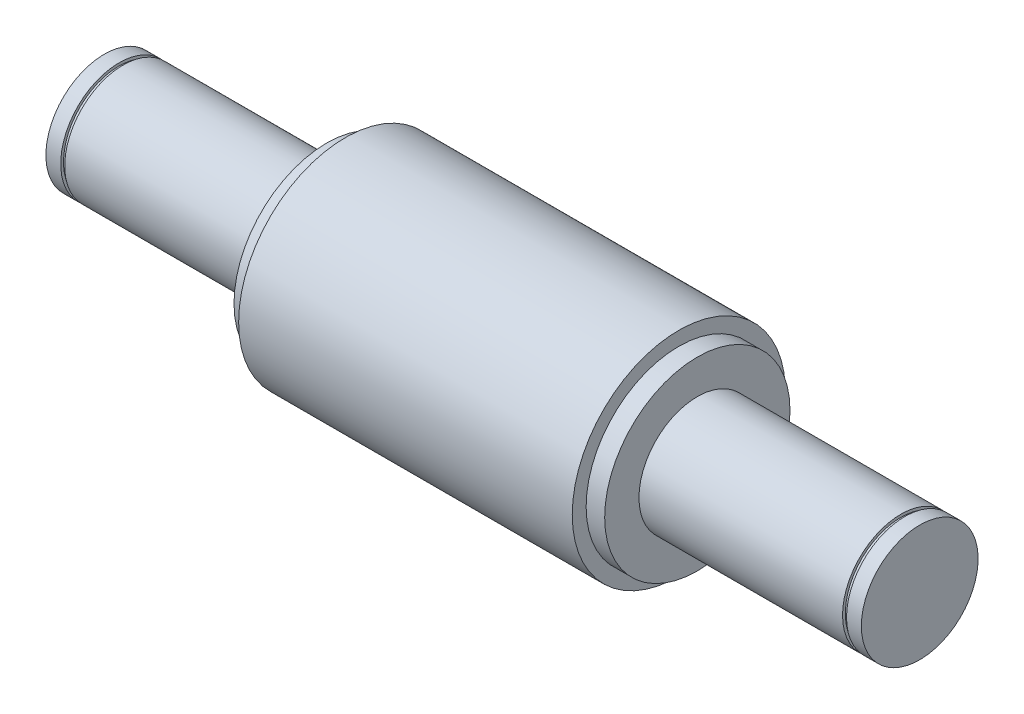
ISO-10303-21;
HEADER;
FILE_DESCRIPTION(('STEP AP214'),'2;1');
FILE_NAME('part.step','',(''),(''),'','','');
FILE_SCHEMA(('AUTOMOTIVE_DESIGN { 1 0 10303 214 1 1 1 1 }'));
ENDSEC;
DATA;
#1=APPLICATION_CONTEXT('core data for automotive mechanical design processes');
#2=APPLICATION_PROTOCOL_DEFINITION('international standard','automotive_design',2000,#1);
#3=PRODUCT_CONTEXT('',#1,'mechanical');
#4=PRODUCT('Part','Part','',(#3));
#5=PRODUCT_RELATED_PRODUCT_CATEGORY('part','',(#4));
#6=PRODUCT_DEFINITION_FORMATION('','',#4);
#7=PRODUCT_DEFINITION_CONTEXT('part definition',#1,'design');
#8=PRODUCT_DEFINITION('design','',#6,#7);
#9=PRODUCT_DEFINITION_SHAPE('','',#8);
#10=(LENGTH_UNIT() NAMED_UNIT(*) SI_UNIT(.MILLI.,.METRE.));
#11=(NAMED_UNIT(*) PLANE_ANGLE_UNIT() SI_UNIT($,.RADIAN.));
#12=(NAMED_UNIT(*) SI_UNIT($,.STERADIAN.) SOLID_ANGLE_UNIT());
#13=UNCERTAINTY_MEASURE_WITH_UNIT(LENGTH_MEASURE(1.E-05),#10,'distance_accuracy_value','');
#14=(GEOMETRIC_REPRESENTATION_CONTEXT(3) GLOBAL_UNCERTAINTY_ASSIGNED_CONTEXT((#13)) GLOBAL_UNIT_ASSIGNED_CONTEXT((#10,
#11,#12)) REPRESENTATION_CONTEXT('',''));
#15=CARTESIAN_POINT('',(0.,0.,0.));
#16=DIRECTION('',(0.,0.,1.));
#17=DIRECTION('',(1.,0.,0.));
#18=AXIS2_PLACEMENT_3D('',#15,#16,#17);
#19=CARTESIAN_POINT('',(100.,0.,0.));
#20=DIRECTION('',(1.,0.,0.));
#21=DIRECTION('',(0.,0.,-1.));
#22=AXIS2_PLACEMENT_3D('',#19,#20,#21);
#23=PLANE('',#22);
#24=CARTESIAN_POINT('',(100.,0.,0.));
#25=DIRECTION('',(1.,0.,0.));
#26=DIRECTION('',(0.,0.,-1.));
#27=AXIS2_PLACEMENT_3D('',#24,#25,#26);
#28=CIRCLE('',#27,50.);
#29=CARTESIAN_POINT('',(100.,0.,-50.));
#30=VERTEX_POINT('',#29);
#31=EDGE_CURVE('E43',#30,#30,#28,.T.);
#32=ORIENTED_EDGE('',*,*,#31,.T.);
#33=EDGE_LOOP('',(#32));
#34=FACE_BOUND('',#33,.T.);
#35=CARTESIAN_POINT('',(100.,0.,0.));
#36=DIRECTION('',(1.,0.,0.));
#37=DIRECTION('',(0.,0.,-1.));
#38=AXIS2_PLACEMENT_3D('',#35,#36,#37);
#39=CIRCLE('',#38,31.5);
#40=CARTESIAN_POINT('',(100.,0.,31.5));
#41=VERTEX_POINT('',#40);
#42=EDGE_CURVE('E58',#41,#41,#39,.T.);
#43=ORIENTED_EDGE('',*,*,#42,.F.);
#44=EDGE_LOOP('',(#43));
#45=FACE_BOUND('',#44,.T.);
#46=ADVANCED_FACE('F35',(#34,#45),#23,.T.);
#47=CARTESIAN_POINT('',(100.,0.,0.));
#48=DIRECTION('',(-1.,0.,0.));
#49=DIRECTION('',(0.,0.,1.));
#50=AXIS2_PLACEMENT_3D('',#47,#48,#49);
#51=CYLINDRICAL_SURFACE('',#50,50.);
#52=CARTESIAN_POINT('',(90.,0.,0.));
#53=DIRECTION('',(1.,0.,0.));
#54=DIRECTION('',(0.,0.,-1.));
#55=AXIS2_PLACEMENT_3D('',#52,#53,#54);
#56=CIRCLE('',#55,50.);
#57=CARTESIAN_POINT('',(90.,0.,-50.));
#58=VERTEX_POINT('',#57);
#59=EDGE_CURVE('E87',#58,#58,#56,.T.);
#60=ORIENTED_EDGE('',*,*,#59,.T.);
#61=EDGE_LOOP('',(#60));
#62=FACE_BOUND('',#61,.T.);
#63=ORIENTED_EDGE('',*,*,#31,.F.);
#64=EDGE_LOOP('',(#63));
#65=FACE_BOUND('',#64,.T.);
#66=ADVANCED_FACE('F37',(#62,#65),#51,.T.);
#67=CARTESIAN_POINT('',(90.,0.,0.));
#68=DIRECTION('',(1.,0.,0.));
#69=DIRECTION('',(0.,0.,-1.));
#70=AXIS2_PLACEMENT_3D('',#67,#68,#69);
#71=PLANE('',#70);
#72=CARTESIAN_POINT('',(90.,0.,0.));
#73=DIRECTION('',(1.,0.,0.));
#74=DIRECTION('',(0.,0.,-1.));
#75=AXIS2_PLACEMENT_3D('',#72,#73,#74);
#76=CIRCLE('',#75,57.5);
#77=CARTESIAN_POINT('',(90.,0.,57.5));
#78=VERTEX_POINT('',#77);
#79=EDGE_CURVE('E93',#78,#78,#76,.T.);
#80=ORIENTED_EDGE('',*,*,#79,.T.);
#81=EDGE_LOOP('',(#80));
#82=FACE_BOUND('',#81,.T.);
#83=ORIENTED_EDGE('',*,*,#59,.F.);
#84=EDGE_LOOP('',(#83));
#85=FACE_BOUND('',#84,.T.);
#86=ADVANCED_FACE('F103',(#82,#85),#71,.T.);
#87=CARTESIAN_POINT('',(-90.,0.,0.));
#88=DIRECTION('',(1.,0.,0.));
#89=DIRECTION('',(0.,0.,-1.));
#90=AXIS2_PLACEMENT_3D('',#87,#88,#89);
#91=PLANE('',#90);
#92=CARTESIAN_POINT('',(-90.,0.,0.));
#93=DIRECTION('',(1.,0.,0.));
#94=DIRECTION('',(0.,0.,-1.));
#95=AXIS2_PLACEMENT_3D('',#92,#93,#94);
#96=CIRCLE('',#95,57.5);
#97=CARTESIAN_POINT('',(-90.,0.,57.5));
#98=VERTEX_POINT('',#97);
#99=EDGE_CURVE('E92',#98,#98,#96,.T.);
#100=ORIENTED_EDGE('',*,*,#99,.F.);
#101=EDGE_LOOP('',(#100));
#102=FACE_BOUND('',#101,.T.);
#103=CARTESIAN_POINT('',(-90.,0.,0.));
#104=DIRECTION('',(1.,0.,0.));
#105=DIRECTION('',(0.,0.,-1.));
#106=AXIS2_PLACEMENT_3D('',#103,#104,#105);
#107=CIRCLE('',#106,50.);
#108=CARTESIAN_POINT('',(-90.,0.,-50.));
#109=VERTEX_POINT('',#108);
#110=EDGE_CURVE('E10',#109,#109,#107,.T.);
#111=ORIENTED_EDGE('',*,*,#110,.T.);
#112=EDGE_LOOP('',(#111));
#113=FACE_BOUND('',#112,.T.);
#114=ADVANCED_FACE('F101',(#102,#113),#91,.F.);
#115=CARTESIAN_POINT('',(90.,0.,0.));
#116=DIRECTION('',(-1.,0.,0.));
#117=DIRECTION('',(0.,0.,1.));
#118=AXIS2_PLACEMENT_3D('',#115,#116,#117);
#119=CYLINDRICAL_SURFACE('',#118,57.5);
#120=CARTESIAN_POINT('',(90.,0.,57.5));
#121=CARTESIAN_POINT('',(88.125,0.,57.5));
#122=CARTESIAN_POINT('',(86.25,0.,57.5));
#123=CARTESIAN_POINT('',(82.5,0.,57.5));
#124=CARTESIAN_POINT('',(80.625,0.,57.5));
#125=CARTESIAN_POINT('',(76.875,0.,57.5));
#126=CARTESIAN_POINT('',(75.,0.,57.5));
#127=CARTESIAN_POINT('',(71.25,0.,57.5));
#128=CARTESIAN_POINT('',(69.375,0.,57.5));
#129=CARTESIAN_POINT('',(65.625,0.,57.5));
#130=CARTESIAN_POINT('',(63.75,0.,57.5));
#131=CARTESIAN_POINT('',(60.,0.,57.5));
#132=CARTESIAN_POINT('',(58.125,0.,57.5));
#133=CARTESIAN_POINT('',(54.375,0.,57.5));
#134=CARTESIAN_POINT('',(52.5,0.,57.5));
#135=CARTESIAN_POINT('',(48.75,0.,57.5));
#136=CARTESIAN_POINT('',(46.875,0.,57.5));
#137=CARTESIAN_POINT('',(43.125,0.,57.5));
#138=CARTESIAN_POINT('',(41.25,0.,57.5));
#139=CARTESIAN_POINT('',(37.5,0.,57.5));
#140=CARTESIAN_POINT('',(35.625,0.,57.5));
#141=CARTESIAN_POINT('',(31.875,0.,57.5));
#142=CARTESIAN_POINT('',(30.,0.,57.5));
#143=CARTESIAN_POINT('',(26.25,0.,57.5));
#144=CARTESIAN_POINT('',(24.375,0.,57.5));
#145=CARTESIAN_POINT('',(20.625,0.,57.5));
#146=CARTESIAN_POINT('',(18.75,0.,57.5));
#147=CARTESIAN_POINT('',(15.,0.,57.5));
#148=CARTESIAN_POINT('',(13.125,0.,57.5));
#149=CARTESIAN_POINT('',(9.37499999999999,0.,57.5));
#150=CARTESIAN_POINT('',(7.49999999999999,0.,57.5));
#151=CARTESIAN_POINT('',(3.74999999999999,0.,57.5));
#152=CARTESIAN_POINT('',(1.87499999999999,0.,57.5));
#153=CARTESIAN_POINT('',(-1.87500000000002,0.,57.5));
#154=CARTESIAN_POINT('',(-3.75000000000002,0.,57.5));
#155=CARTESIAN_POINT('',(-7.50000000000002,0.,57.5));
#156=CARTESIAN_POINT('',(-9.37500000000002,0.,57.5));
#157=CARTESIAN_POINT('',(-13.125,0.,57.5));
#158=CARTESIAN_POINT('',(-15.,0.,57.5));
#159=CARTESIAN_POINT('',(-18.75,0.,57.5));
#160=CARTESIAN_POINT('',(-20.625,0.,57.5));
#161=CARTESIAN_POINT('',(-24.375,0.,57.5));
#162=CARTESIAN_POINT('',(-26.25,0.,57.5));
#163=CARTESIAN_POINT('',(-30.,0.,57.5));
#164=CARTESIAN_POINT('',(-31.875,0.,57.5));
#165=CARTESIAN_POINT('',(-35.625,0.,57.5));
#166=CARTESIAN_POINT('',(-37.5,0.,57.5));
#167=CARTESIAN_POINT('',(-41.25,0.,57.5));
#168=CARTESIAN_POINT('',(-43.125,0.,57.5));
#169=CARTESIAN_POINT('',(-46.875,0.,57.5));
#170=CARTESIAN_POINT('',(-48.75,0.,57.5));
#171=CARTESIAN_POINT('',(-52.5,0.,57.5));
#172=CARTESIAN_POINT('',(-54.375,0.,57.5));
#173=CARTESIAN_POINT('',(-58.125,0.,57.5));
#174=CARTESIAN_POINT('',(-60.,0.,57.5));
#175=CARTESIAN_POINT('',(-63.75,0.,57.5));
#176=CARTESIAN_POINT('',(-65.625,0.,57.5));
#177=CARTESIAN_POINT('',(-69.375,0.,57.5));
#178=CARTESIAN_POINT('',(-71.25,0.,57.5));
#179=CARTESIAN_POINT('',(-75.,0.,57.5));
#180=CARTESIAN_POINT('',(-76.875,0.,57.5));
#181=CARTESIAN_POINT('',(-80.625,0.,57.5));
#182=CARTESIAN_POINT('',(-82.5,0.,57.5));
#183=CARTESIAN_POINT('',(-86.25,0.,57.5));
#184=CARTESIAN_POINT('',(-88.125,0.,57.5));
#185=CARTESIAN_POINT('',(-90.,0.,57.5));
#186=B_SPLINE_CURVE_WITH_KNOTS('',3,(#120,#121,#122,#123,#124,#125,#126,#127,#128,#129,#130,
#131,#132,#133,#134,#135,#136,#137,#138,#139,#140,#141,#142,#143,#144,#145,#146,#147,#148,#149,
#150,#151,#152,#153,#154,#155,#156,#157,#158,#159,#160,#161,#162,#163,#164,#165,#166,#167,#168,
#169,#170,#171,#172,#173,#174,#175,#176,#177,#178,#179,#180,#181,#182,#183,#184,#185),
.UNSPECIFIED.,.F.,.F.,(4,2,2,2,2,2,2,2,2,2,2,2,2,2,2,2,2,2,2,2,2,2,2,2,2,2,2,2,2,2,2,2,4),(0.,
5.62500000000001,11.25,16.875,22.5,28.125,33.75,39.375,45.,50.625,56.25,61.875,67.5,73.125,
78.75,84.375,90.,95.625,101.25,106.875,112.5,118.125,123.75,129.375,135.,140.625,146.25,151.875,
157.5,163.125,168.75,174.375,180.),.UNSPECIFIED.);
#187=EDGE_CURVE('BSEAM99',#78,#98,#186,.T.);
#188=ORIENTED_EDGE('',*,*,#79,.F.);
#189=ORIENTED_EDGE('',*,*,#99,.T.);
#190=ORIENTED_EDGE('',*,*,#187,.T.);
#191=ORIENTED_EDGE('',*,*,#187,.F.);
#192=EDGE_LOOP('',(#188,#190,#189,#191));
#193=FACE_BOUND('',#192,.T.);
#194=ADVANCED_FACE('F99',(#193),#119,.T.);
#195=CARTESIAN_POINT('',(-100.,0.,0.));
#196=DIRECTION('',(1.,0.,0.));
#197=DIRECTION('',(0.,0.,-1.));
#198=AXIS2_PLACEMENT_3D('',#195,#196,#197);
#199=PLANE('',#198);
#200=CARTESIAN_POINT('',(-100.,0.,0.));
#201=DIRECTION('',(1.,0.,0.));
#202=DIRECTION('',(0.,0.,-1.));
#203=AXIS2_PLACEMENT_3D('',#200,#201,#202);
#204=CIRCLE('',#203,31.5);
#205=CARTESIAN_POINT('',(-100.,0.,-31.5));
#206=VERTEX_POINT('',#205);
#207=EDGE_CURVE('E65',#206,#206,#204,.T.);
#208=ORIENTED_EDGE('',*,*,#207,.T.);
#209=EDGE_LOOP('',(#208));
#210=FACE_BOUND('',#209,.T.);
#211=CARTESIAN_POINT('',(-100.,0.,0.));
#212=DIRECTION('',(1.,0.,0.));
#213=DIRECTION('',(0.,0.,-1.));
#214=AXIS2_PLACEMENT_3D('',#211,#212,#213);
#215=CIRCLE('',#214,50.);
#216=CARTESIAN_POINT('',(-100.,0.,-50.));
#217=VERTEX_POINT('',#216);
#218=EDGE_CURVE('E48',#217,#217,#215,.T.);
#219=ORIENTED_EDGE('',*,*,#218,.F.);
#220=EDGE_LOOP('',(#219));
#221=FACE_BOUND('',#220,.T.);
#222=ADVANCED_FACE('F109',(#210,#221),#199,.F.);
#223=ORIENTED_EDGE('',*,*,#218,.T.);
#224=EDGE_LOOP('',(#223));
#225=FACE_BOUND('',#224,.T.);
#226=ORIENTED_EDGE('',*,*,#110,.F.);
#227=EDGE_LOOP('',(#226));
#228=FACE_BOUND('',#227,.T.);
#229=ADVANCED_FACE('F121',(#225,#228),#51,.T.);
#230=CARTESIAN_POINT('',(220.,0.,0.));
#231=DIRECTION('',(-1.,0.,0.));
#232=DIRECTION('',(0.,0.,1.));
#233=AXIS2_PLACEMENT_3D('',#230,#231,#232);
#234=CYLINDRICAL_SURFACE('',#233,31.5);
#235=CARTESIAN_POINT('',(209.85,0.,0.));
#236=DIRECTION('',(-1.,0.,0.));
#237=DIRECTION('',(0.,0.,1.));
#238=AXIS2_PLACEMENT_3D('',#235,#236,#237);
#239=CIRCLE('',#238,31.5);
#240=CARTESIAN_POINT('',(209.85,0.,31.5));
#241=VERTEX_POINT('',#240);
#242=EDGE_CURVE('E52',#241,#241,#239,.T.);
#243=CARTESIAN_POINT('',(209.85,0.,31.5));
#244=CARTESIAN_POINT('',(208.705729166667,0.,31.5));
#245=CARTESIAN_POINT('',(207.561458333333,0.,31.5));
#246=CARTESIAN_POINT('',(205.272916666667,0.,31.5));
#247=CARTESIAN_POINT('',(204.128645833333,0.,31.5));
#248=CARTESIAN_POINT('',(201.840104166667,0.,31.5));
#249=CARTESIAN_POINT('',(200.695833333333,0.,31.5));
#250=CARTESIAN_POINT('',(198.407291666667,0.,31.5));
#251=CARTESIAN_POINT('',(197.263020833333,0.,31.5));
#252=CARTESIAN_POINT('',(194.974479166667,0.,31.5));
#253=CARTESIAN_POINT('',(193.830208333333,0.,31.5));
#254=CARTESIAN_POINT('',(191.541666666667,0.,31.5));
#255=CARTESIAN_POINT('',(190.397395833333,0.,31.5));
#256=CARTESIAN_POINT('',(188.108854166667,0.,31.5));
#257=CARTESIAN_POINT('',(186.964583333333,0.,31.5));
#258=CARTESIAN_POINT('',(184.676041666667,0.,31.5));
#259=CARTESIAN_POINT('',(183.531770833333,0.,31.5));
#260=CARTESIAN_POINT('',(181.243229166667,0.,31.5));
#261=CARTESIAN_POINT('',(180.098958333333,0.,31.5));
#262=CARTESIAN_POINT('',(177.810416666667,0.,31.5));
#263=CARTESIAN_POINT('',(176.666145833333,0.,31.5));
#264=CARTESIAN_POINT('',(174.377604166667,0.,31.5));
#265=CARTESIAN_POINT('',(173.233333333333,0.,31.5));
#266=CARTESIAN_POINT('',(170.944791666667,0.,31.5));
#267=CARTESIAN_POINT('',(169.800520833333,0.,31.5));
#268=CARTESIAN_POINT('',(167.511979166667,0.,31.5));
#269=CARTESIAN_POINT('',(166.367708333333,0.,31.5));
#270=CARTESIAN_POINT('',(164.079166666667,0.,31.5));
#271=CARTESIAN_POINT('',(162.934895833333,0.,31.5));
#272=CARTESIAN_POINT('',(160.646354166667,0.,31.5));
#273=CARTESIAN_POINT('',(159.502083333333,0.,31.5));
#274=CARTESIAN_POINT('',(157.213541666667,0.,31.5));
#275=CARTESIAN_POINT('',(156.069270833333,0.,31.5));
#276=CARTESIAN_POINT('',(153.780729166667,0.,31.5));
#277=CARTESIAN_POINT('',(152.636458333333,0.,31.5));
#278=CARTESIAN_POINT('',(150.347916666667,0.,31.5));
#279=CARTESIAN_POINT('',(149.203645833333,0.,31.5));
#280=CARTESIAN_POINT('',(146.915104166667,0.,31.5));
#281=CARTESIAN_POINT('',(145.770833333333,0.,31.5));
#282=CARTESIAN_POINT('',(143.482291666667,0.,31.5));
#283=CARTESIAN_POINT('',(142.338020833333,0.,31.5));
#284=CARTESIAN_POINT('',(140.049479166667,0.,31.5));
#285=CARTESIAN_POINT('',(138.905208333333,0.,31.5));
#286=CARTESIAN_POINT('',(136.616666666667,0.,31.5));
#287=CARTESIAN_POINT('',(135.472395833333,0.,31.5));
#288=CARTESIAN_POINT('',(133.183854166667,0.,31.5));
#289=CARTESIAN_POINT('',(132.039583333333,0.,31.5));
#290=CARTESIAN_POINT('',(129.751041666667,0.,31.5));
#291=CARTESIAN_POINT('',(128.606770833333,0.,31.5));
#292=CARTESIAN_POINT('',(126.318229166667,0.,31.5));
#293=CARTESIAN_POINT('',(125.173958333333,0.,31.5));
#294=CARTESIAN_POINT('',(122.885416666667,0.,31.5));
#295=CARTESIAN_POINT('',(121.741145833333,0.,31.5));
#296=CARTESIAN_POINT('',(119.452604166667,0.,31.5));
#297=CARTESIAN_POINT('',(118.308333333333,0.,31.5));
#298=CARTESIAN_POINT('',(116.019791666667,0.,31.5));
#299=CARTESIAN_POINT('',(114.875520833333,0.,31.5));
#300=CARTESIAN_POINT('',(112.586979166667,0.,31.5));
#301=CARTESIAN_POINT('',(111.442708333333,0.,31.5));
#302=CARTESIAN_POINT('',(109.154166666667,0.,31.5));
#303=CARTESIAN_POINT('',(108.009895833333,0.,31.5));
#304=CARTESIAN_POINT('',(105.721354166667,0.,31.5));
#305=CARTESIAN_POINT('',(104.577083333333,0.,31.5));
#306=CARTESIAN_POINT('',(102.288541666667,0.,31.5));
#307=CARTESIAN_POINT('',(101.144270833333,0.,31.5));
#308=CARTESIAN_POINT('',(100.,0.,31.5));
#309=B_SPLINE_CURVE_WITH_KNOTS('',3,(#243,#244,#245,#246,#247,#248,#249,#250,#251,#252,#253,
#254,#255,#256,#257,#258,#259,#260,#261,#262,#263,#264,#265,#266,#267,#268,#269,#270,#271,#272,
#273,#274,#275,#276,#277,#278,#279,#280,#281,#282,#283,#284,#285,#286,#287,#288,#289,#290,#291,
#292,#293,#294,#295,#296,#297,#298,#299,#300,#301,#302,#303,#304,#305,#306,#307,#308),
.UNSPECIFIED.,.F.,.F.,(4,2,2,2,2,2,2,2,2,2,2,2,2,2,2,2,2,2,2,2,2,2,2,2,2,2,2,2,2,2,2,2,4),(0.,
3.43281249999999,6.86562499999999,10.2984375,13.73125,17.1640625,20.596875,24.0296875,27.4625,
30.8953125,34.328125,37.7609375,41.19375,44.6265625,48.059375,51.4921875,54.925,58.3578125,
61.790625,65.2234375,68.6562499999999,72.0890625,75.521875,78.9546875,82.3875,85.8203125,
89.253125,92.6859375,96.11875,99.5515625,102.984375,106.4171875,109.85),.UNSPECIFIED.);
#310=EDGE_CURVE('BSEAM128',#241,#41,#309,.T.);
#311=ORIENTED_EDGE('',*,*,#242,.T.);
#312=ORIENTED_EDGE('',*,*,#42,.T.);
#313=ORIENTED_EDGE('',*,*,#310,.T.);
#314=ORIENTED_EDGE('',*,*,#310,.F.);
#315=EDGE_LOOP('',(#311,#313,#312,#314));
#316=FACE_BOUND('',#315,.T.);
#317=ADVANCED_FACE('F128',(#316),#234,.T.);
#318=CARTESIAN_POINT('',(212.,0.,0.));
#319=DIRECTION('',(1.,0.,0.));
#320=DIRECTION('',(0.,0.,-1.));
#321=AXIS2_PLACEMENT_3D('',#318,#319,#320);
#322=PLANE('',#321);
#323=CARTESIAN_POINT('',(212.,0.,0.));
#324=DIRECTION('',(1.,0.,0.));
#325=DIRECTION('',(0.,0.,-1.));
#326=AXIS2_PLACEMENT_3D('',#323,#324,#325);
#327=CIRCLE('',#326,30.);
#328=CARTESIAN_POINT('',(212.,0.,-30.));
#329=VERTEX_POINT('',#328);
#330=EDGE_CURVE('E77',#329,#329,#327,.T.);
#331=ORIENTED_EDGE('',*,*,#330,.T.);
#332=EDGE_LOOP('',(#331));
#333=FACE_BOUND('',#332,.T.);
#334=CARTESIAN_POINT('',(212.,0.,0.));
#335=DIRECTION('',(1.,0.,0.));
#336=DIRECTION('',(0.,0.,-1.));
#337=AXIS2_PLACEMENT_3D('',#334,#335,#336);
#338=CIRCLE('',#337,31.5);
#339=CARTESIAN_POINT('',(212.,0.,31.5));
#340=VERTEX_POINT('',#339);
#341=EDGE_CURVE('E55',#340,#340,#338,.T.);
#342=ORIENTED_EDGE('',*,*,#341,.F.);
#343=EDGE_LOOP('',(#342));
#344=FACE_BOUND('',#343,.T.);
#345=ADVANCED_FACE('F222',(#333,#344),#322,.F.);
#346=CARTESIAN_POINT('',(209.85,0.,0.));
#347=DIRECTION('',(-1.,0.,0.));
#348=DIRECTION('',(0.,0.,1.));
#349=AXIS2_PLACEMENT_3D('',#346,#347,#348);
#350=PLANE('',#349);
#351=CARTESIAN_POINT('',(209.85,0.,0.));
#352=DIRECTION('',(1.,0.,0.));
#353=DIRECTION('',(0.,0.,-1.));
#354=AXIS2_PLACEMENT_3D('',#351,#352,#353);
#355=CIRCLE('',#354,30.);
#356=CARTESIAN_POINT('',(209.85,0.,-30.));
#357=VERTEX_POINT('',#356);
#358=EDGE_CURVE('E56',#357,#357,#355,.T.);
#359=ORIENTED_EDGE('',*,*,#358,.F.);
#360=EDGE_LOOP('',(#359));
#361=FACE_BOUND('',#360,.T.);
#362=ORIENTED_EDGE('',*,*,#242,.F.);
#363=EDGE_LOOP('',(#362));
#364=FACE_BOUND('',#363,.T.);
#365=ADVANCED_FACE('F213',(#361,#364),#350,.F.);
#366=CARTESIAN_POINT('',(220.,0.,0.));
#367=DIRECTION('',(1.,0.,0.));
#368=DIRECTION('',(0.,0.,-1.));
#369=AXIS2_PLACEMENT_3D('',#366,#367,#368);
#370=CYLINDRICAL_SURFACE('',#369,30.);
#371=ORIENTED_EDGE('',*,*,#358,.T.);
#372=EDGE_LOOP('',(#371));
#373=FACE_BOUND('',#372,.T.);
#374=ORIENTED_EDGE('',*,*,#330,.F.);
#375=EDGE_LOOP('',(#374));
#376=FACE_BOUND('',#375,.T.);
#377=ADVANCED_FACE('F209',(#373,#376),#370,.T.);
#378=CARTESIAN_POINT('',(220.,0.,0.));
#379=DIRECTION('',(1.,0.,0.));
#380=DIRECTION('',(0.,0.,-1.));
#381=AXIS2_PLACEMENT_3D('',#378,#379,#380);
#382=PLANE('',#381);
#383=CARTESIAN_POINT('',(220.,0.,0.));
#384=DIRECTION('',(1.,0.,0.));
#385=DIRECTION('',(0.,0.,-1.));
#386=AXIS2_PLACEMENT_3D('',#383,#384,#385);
#387=CIRCLE('',#386,31.5);
#388=CARTESIAN_POINT('',(220.,0.,31.5));
#389=VERTEX_POINT('',#388);
#390=EDGE_CURVE('E84',#389,#389,#387,.T.);
#391=ORIENTED_EDGE('',*,*,#390,.T.);
#392=EDGE_LOOP('',(#391));
#393=FACE_BOUND('',#392,.T.);
#394=ADVANCED_FACE('F150',(#393),#382,.T.);
#395=CARTESIAN_POINT('',(212.,0.,31.5));
#396=CARTESIAN_POINT('',(212.083333333333,0.,31.5));
#397=CARTESIAN_POINT('',(212.166666666667,0.,31.5));
#398=CARTESIAN_POINT('',(212.333333333333,0.,31.5));
#399=CARTESIAN_POINT('',(212.416666666667,0.,31.5));
#400=CARTESIAN_POINT('',(212.583333333333,0.,31.5));
#401=CARTESIAN_POINT('',(212.666666666667,0.,31.5));
#402=CARTESIAN_POINT('',(212.833333333333,0.,31.5));
#403=CARTESIAN_POINT('',(212.916666666667,0.,31.5));
#404=CARTESIAN_POINT('',(213.083333333333,0.,31.5));
#405=CARTESIAN_POINT('',(213.166666666667,0.,31.5));
#406=CARTESIAN_POINT('',(213.333333333333,0.,31.5));
#407=CARTESIAN_POINT('',(213.416666666667,0.,31.5));
#408=CARTESIAN_POINT('',(213.583333333333,0.,31.5));
#409=CARTESIAN_POINT('',(213.666666666667,0.,31.5));
#410=CARTESIAN_POINT('',(213.833333333333,0.,31.5));
#411=CARTESIAN_POINT('',(213.916666666667,0.,31.5));
#412=CARTESIAN_POINT('',(214.083333333333,0.,31.5));
#413=CARTESIAN_POINT('',(214.166666666667,0.,31.5));
#414=CARTESIAN_POINT('',(214.333333333333,0.,31.5));
#415=CARTESIAN_POINT('',(214.416666666667,0.,31.5));
#416=CARTESIAN_POINT('',(214.583333333333,0.,31.5));
#417=CARTESIAN_POINT('',(214.666666666667,0.,31.5));
#418=CARTESIAN_POINT('',(214.833333333333,0.,31.5));
#419=CARTESIAN_POINT('',(214.916666666667,0.,31.5));
#420=CARTESIAN_POINT('',(215.083333333333,0.,31.5));
#421=CARTESIAN_POINT('',(215.166666666667,0.,31.5));
#422=CARTESIAN_POINT('',(215.333333333333,0.,31.5));
#423=CARTESIAN_POINT('',(215.416666666667,0.,31.5));
#424=CARTESIAN_POINT('',(215.583333333333,0.,31.5));
#425=CARTESIAN_POINT('',(215.666666666667,0.,31.5));
#426=CARTESIAN_POINT('',(215.833333333333,0.,31.5));
#427=CARTESIAN_POINT('',(215.916666666667,0.,31.5));
#428=CARTESIAN_POINT('',(216.083333333333,0.,31.5));
#429=CARTESIAN_POINT('',(216.166666666667,0.,31.5));
#430=CARTESIAN_POINT('',(216.333333333333,0.,31.5));
#431=CARTESIAN_POINT('',(216.416666666667,0.,31.5));
#432=CARTESIAN_POINT('',(216.583333333333,0.,31.5));
#433=CARTESIAN_POINT('',(216.666666666667,0.,31.5));
#434=CARTESIAN_POINT('',(216.833333333333,0.,31.5));
#435=CARTESIAN_POINT('',(216.916666666667,0.,31.5));
#436=CARTESIAN_POINT('',(217.083333333333,0.,31.5));
#437=CARTESIAN_POINT('',(217.166666666667,0.,31.5));
#438=CARTESIAN_POINT('',(217.333333333333,0.,31.5));
#439=CARTESIAN_POINT('',(217.416666666667,0.,31.5));
#440=CARTESIAN_POINT('',(217.583333333333,0.,31.5));
#441=CARTESIAN_POINT('',(217.666666666667,0.,31.5));
#442=CARTESIAN_POINT('',(217.833333333333,0.,31.5));
#443=CARTESIAN_POINT('',(217.916666666667,0.,31.5));
#444=CARTESIAN_POINT('',(218.083333333333,0.,31.5));
#445=CARTESIAN_POINT('',(218.166666666667,0.,31.5));
#446=CARTESIAN_POINT('',(218.333333333333,0.,31.5));
#447=CARTESIAN_POINT('',(218.416666666667,0.,31.5));
#448=CARTESIAN_POINT('',(218.583333333333,0.,31.5));
#449=CARTESIAN_POINT('',(218.666666666667,0.,31.5));
#450=CARTESIAN_POINT('',(218.833333333333,0.,31.5));
#451=CARTESIAN_POINT('',(218.916666666667,0.,31.5));
#452=CARTESIAN_POINT('',(219.083333333333,0.,31.5));
#453=CARTESIAN_POINT('',(219.166666666667,0.,31.5));
#454=CARTESIAN_POINT('',(219.333333333333,0.,31.5));
#455=CARTESIAN_POINT('',(219.416666666667,0.,31.5));
#456=CARTESIAN_POINT('',(219.583333333333,0.,31.5));
#457=CARTESIAN_POINT('',(219.666666666667,0.,31.5));
#458=CARTESIAN_POINT('',(219.833333333333,0.,31.5));
#459=CARTESIAN_POINT('',(219.916666666667,0.,31.5));
#460=CARTESIAN_POINT('',(220.,0.,31.5));
#461=B_SPLINE_CURVE_WITH_KNOTS('',3,(#395,#396,#397,#398,#399,#400,#401,#402,#403,#404,#405,
#406,#407,#408,#409,#410,#411,#412,#413,#414,#415,#416,#417,#418,#419,#420,#421,#422,#423,#424,
#425,#426,#427,#428,#429,#430,#431,#432,#433,#434,#435,#436,#437,#438,#439,#440,#441,#442,#443,
#444,#445,#446,#447,#448,#449,#450,#451,#452,#453,#454,#455,#456,#457,#458,#459,#460),
.UNSPECIFIED.,.F.,.F.,(4,2,2,2,2,2,2,2,2,2,2,2,2,2,2,2,2,2,2,2,2,2,2,2,2,2,2,2,2,2,2,2,4),(0.,
0.25,0.5,0.750000000000001,1.,1.25,1.5,1.75,2.,2.25,2.5,2.75,3.,3.25,3.5,3.75,4.,4.25,4.5,4.75,
5.,5.25,5.50000000000001,5.75000000000001,6.00000000000001,6.25000000000001,6.50000000000001,
6.75000000000001,7.00000000000003,7.25000000000003,7.50000000000003,7.75000000000003,
8.00000000000004),.UNSPECIFIED.);
#462=EDGE_CURVE('BSEAM139',#340,#389,#461,.T.);
#463=ORIENTED_EDGE('',*,*,#341,.T.);
#464=ORIENTED_EDGE('',*,*,#390,.F.);
#465=ORIENTED_EDGE('',*,*,#462,.T.);
#466=ORIENTED_EDGE('',*,*,#462,.F.);
#467=EDGE_LOOP('',(#463,#465,#464,#466));
#468=FACE_BOUND('',#467,.T.);
#469=ADVANCED_FACE('F139',(#468),#234,.T.);
#470=CARTESIAN_POINT('',(-220.,0.,0.));
#471=DIRECTION('',(1.,0.,0.));
#472=DIRECTION('',(0.,0.,-1.));
#473=AXIS2_PLACEMENT_3D('',#470,#471,#472);
#474=CYLINDRICAL_SURFACE('',#473,31.5);
#475=CARTESIAN_POINT('',(-209.85,0.,0.));
#476=DIRECTION('',(1.,0.,0.));
#477=DIRECTION('',(0.,0.,-1.));
#478=AXIS2_PLACEMENT_3D('',#475,#476,#477);
#479=CIRCLE('',#478,31.5);
#480=CARTESIAN_POINT('',(-209.85,0.,-31.5));
#481=VERTEX_POINT('',#480);
#482=EDGE_CURVE('E59',#481,#481,#479,.F.);
#483=CARTESIAN_POINT('',(-209.85,0.,-31.5));
#484=CARTESIAN_POINT('',(-208.705729166667,0.,-31.5));
#485=CARTESIAN_POINT('',(-207.561458333333,0.,-31.5));
#486=CARTESIAN_POINT('',(-205.272916666667,0.,-31.5));
#487=CARTESIAN_POINT('',(-204.128645833333,0.,-31.5));
#488=CARTESIAN_POINT('',(-201.840104166667,0.,-31.5));
#489=CARTESIAN_POINT('',(-200.695833333333,0.,-31.5));
#490=CARTESIAN_POINT('',(-198.407291666667,0.,-31.5));
#491=CARTESIAN_POINT('',(-197.263020833333,0.,-31.5));
#492=CARTESIAN_POINT('',(-194.974479166667,0.,-31.5));
#493=CARTESIAN_POINT('',(-193.830208333333,0.,-31.5));
#494=CARTESIAN_POINT('',(-191.541666666667,0.,-31.5));
#495=CARTESIAN_POINT('',(-190.397395833333,0.,-31.5));
#496=CARTESIAN_POINT('',(-188.108854166667,0.,-31.5));
#497=CARTESIAN_POINT('',(-186.964583333333,0.,-31.5));
#498=CARTESIAN_POINT('',(-184.676041666667,0.,-31.5));
#499=CARTESIAN_POINT('',(-183.531770833333,0.,-31.5));
#500=CARTESIAN_POINT('',(-181.243229166667,0.,-31.5));
#501=CARTESIAN_POINT('',(-180.098958333333,0.,-31.5));
#502=CARTESIAN_POINT('',(-177.810416666667,0.,-31.5));
#503=CARTESIAN_POINT('',(-176.666145833333,0.,-31.5));
#504=CARTESIAN_POINT('',(-174.377604166667,0.,-31.5));
#505=CARTESIAN_POINT('',(-173.233333333333,0.,-31.5));
#506=CARTESIAN_POINT('',(-170.944791666667,0.,-31.5));
#507=CARTESIAN_POINT('',(-169.800520833333,0.,-31.5));
#508=CARTESIAN_POINT('',(-167.511979166667,0.,-31.5));
#509=CARTESIAN_POINT('',(-166.367708333333,0.,-31.5));
#510=CARTESIAN_POINT('',(-164.079166666667,0.,-31.5));
#511=CARTESIAN_POINT('',(-162.934895833333,0.,-31.5));
#512=CARTESIAN_POINT('',(-160.646354166667,0.,-31.5));
#513=CARTESIAN_POINT('',(-159.502083333333,0.,-31.5));
#514=CARTESIAN_POINT('',(-157.213541666667,0.,-31.5));
#515=CARTESIAN_POINT('',(-156.069270833333,0.,-31.5));
#516=CARTESIAN_POINT('',(-153.780729166667,0.,-31.5));
#517=CARTESIAN_POINT('',(-152.636458333333,0.,-31.5));
#518=CARTESIAN_POINT('',(-150.347916666667,0.,-31.5));
#519=CARTESIAN_POINT('',(-149.203645833333,0.,-31.5));
#520=CARTESIAN_POINT('',(-146.915104166667,0.,-31.5));
#521=CARTESIAN_POINT('',(-145.770833333333,0.,-31.5));
#522=CARTESIAN_POINT('',(-143.482291666667,0.,-31.5));
#523=CARTESIAN_POINT('',(-142.338020833333,0.,-31.5));
#524=CARTESIAN_POINT('',(-140.049479166667,0.,-31.5));
#525=CARTESIAN_POINT('',(-138.905208333333,0.,-31.5));
#526=CARTESIAN_POINT('',(-136.616666666667,0.,-31.5));
#527=CARTESIAN_POINT('',(-135.472395833333,0.,-31.5));
#528=CARTESIAN_POINT('',(-133.183854166667,0.,-31.5));
#529=CARTESIAN_POINT('',(-132.039583333333,0.,-31.5));
#530=CARTESIAN_POINT('',(-129.751041666667,0.,-31.5));
#531=CARTESIAN_POINT('',(-128.606770833333,0.,-31.5));
#532=CARTESIAN_POINT('',(-126.318229166667,0.,-31.5));
#533=CARTESIAN_POINT('',(-125.173958333333,0.,-31.5));
#534=CARTESIAN_POINT('',(-122.885416666667,0.,-31.5));
#535=CARTESIAN_POINT('',(-121.741145833333,0.,-31.5));
#536=CARTESIAN_POINT('',(-119.452604166667,0.,-31.5));
#537=CARTESIAN_POINT('',(-118.308333333333,0.,-31.5));
#538=CARTESIAN_POINT('',(-116.019791666667,0.,-31.5));
#539=CARTESIAN_POINT('',(-114.875520833333,0.,-31.5));
#540=CARTESIAN_POINT('',(-112.586979166667,0.,-31.5));
#541=CARTESIAN_POINT('',(-111.442708333333,0.,-31.5));
#542=CARTESIAN_POINT('',(-109.154166666667,0.,-31.5));
#543=CARTESIAN_POINT('',(-108.009895833333,0.,-31.5));
#544=CARTESIAN_POINT('',(-105.721354166667,0.,-31.5));
#545=CARTESIAN_POINT('',(-104.577083333333,0.,-31.5));
#546=CARTESIAN_POINT('',(-102.288541666667,0.,-31.5));
#547=CARTESIAN_POINT('',(-101.144270833333,0.,-31.5));
#548=CARTESIAN_POINT('',(-100.,0.,-31.5));
#549=B_SPLINE_CURVE_WITH_KNOTS('',3,(#483,#484,#485,#486,#487,#488,#489,#490,#491,#492,#493,
#494,#495,#496,#497,#498,#499,#500,#501,#502,#503,#504,#505,#506,#507,#508,#509,#510,#511,#512,
#513,#514,#515,#516,#517,#518,#519,#520,#521,#522,#523,#524,#525,#526,#527,#528,#529,#530,#531,
#532,#533,#534,#535,#536,#537,#538,#539,#540,#541,#542,#543,#544,#545,#546,#547,#548),
.UNSPECIFIED.,.F.,.F.,(4,2,2,2,2,2,2,2,2,2,2,2,2,2,2,2,2,2,2,2,2,2,2,2,2,2,2,2,2,2,2,2,4),(0.,
3.43281249999999,6.86562499999999,10.2984375,13.73125,17.1640625,20.596875,24.0296875,27.4625,
30.8953125,34.328125,37.7609375,41.19375,44.6265625,48.059375,51.4921875,54.925,58.3578125,
61.790625,65.2234375,68.6562499999999,72.0890624999999,75.5218749999999,78.9546874999999,
82.3874999999999,85.8203124999999,89.2531249999999,92.6859374999999,96.1187499999999,
99.5515624999999,102.984375,106.4171875,109.85),.UNSPECIFIED.);
#550=EDGE_CURVE('BSEAM136',#481,#206,#549,.T.);
#551=ORIENTED_EDGE('',*,*,#482,.F.);
#552=ORIENTED_EDGE('',*,*,#207,.F.);
#553=ORIENTED_EDGE('',*,*,#550,.T.);
#554=ORIENTED_EDGE('',*,*,#550,.F.);
#555=EDGE_LOOP('',(#551,#553,#552,#554));
#556=FACE_BOUND('',#555,.T.);
#557=ADVANCED_FACE('F136',(#556),#474,.T.);
#558=CARTESIAN_POINT('',(-212.,0.,0.));
#559=DIRECTION('',(-1.,0.,0.));
#560=DIRECTION('',(0.,0.,-1.));
#561=AXIS2_PLACEMENT_3D('',#558,#559,#560);
#562=PLANE('',#561);
#563=CARTESIAN_POINT('',(-212.,0.,0.));
#564=DIRECTION('',(-1.,0.,0.));
#565=DIRECTION('',(0.,0.,1.));
#566=AXIS2_PLACEMENT_3D('',#563,#564,#565);
#567=CIRCLE('',#566,31.5);
#568=CARTESIAN_POINT('',(-212.,0.,-31.5));
#569=VERTEX_POINT('',#568);
#570=EDGE_CURVE('E39',#569,#569,#567,.F.);
#571=ORIENTED_EDGE('',*,*,#570,.T.);
#572=EDGE_LOOP('',(#571));
#573=FACE_BOUND('',#572,.T.);
#574=CARTESIAN_POINT('',(-212.,0.,0.));
#575=DIRECTION('',(1.,0.,0.));
#576=DIRECTION('',(0.,0.,-1.));
#577=AXIS2_PLACEMENT_3D('',#574,#575,#576);
#578=CIRCLE('',#577,30.);
#579=CARTESIAN_POINT('',(-212.,0.,-30.));
#580=VERTEX_POINT('',#579);
#581=EDGE_CURVE('E67',#580,#580,#578,.T.);
#582=ORIENTED_EDGE('',*,*,#581,.F.);
#583=EDGE_LOOP('',(#582));
#584=FACE_BOUND('',#583,.T.);
#585=ADVANCED_FACE('F138',(#573,#584),#562,.F.);
#586=CARTESIAN_POINT('',(-209.85,0.,0.));
#587=DIRECTION('',(1.,0.,0.));
#588=DIRECTION('',(0.,0.,1.));
#589=AXIS2_PLACEMENT_3D('',#586,#587,#588);
#590=PLANE('',#589);
#591=ORIENTED_EDGE('',*,*,#482,.T.);
#592=EDGE_LOOP('',(#591));
#593=FACE_BOUND('',#592,.T.);
#594=CARTESIAN_POINT('',(-209.85,0.,0.));
#595=DIRECTION('',(1.,0.,0.));
#596=DIRECTION('',(0.,0.,-1.));
#597=AXIS2_PLACEMENT_3D('',#594,#595,#596);
#598=CIRCLE('',#597,30.);
#599=CARTESIAN_POINT('',(-209.85,0.,-30.));
#600=VERTEX_POINT('',#599);
#601=EDGE_CURVE('E61',#600,#600,#598,.T.);
#602=ORIENTED_EDGE('',*,*,#601,.T.);
#603=EDGE_LOOP('',(#602));
#604=FACE_BOUND('',#603,.T.);
#605=ADVANCED_FACE('F147',(#593,#604),#590,.F.);
#606=CARTESIAN_POINT('',(-220.,0.,0.));
#607=DIRECTION('',(-1.,0.,0.));
#608=DIRECTION('',(0.,0.,-1.));
#609=AXIS2_PLACEMENT_3D('',#606,#607,#608);
#610=CYLINDRICAL_SURFACE('',#609,30.);
#611=ORIENTED_EDGE('',*,*,#601,.F.);
#612=EDGE_LOOP('',(#611));
#613=FACE_BOUND('',#612,.T.);
#614=ORIENTED_EDGE('',*,*,#581,.T.);
#615=EDGE_LOOP('',(#614));
#616=FACE_BOUND('',#615,.T.);
#617=ADVANCED_FACE('F161',(#613,#616),#610,.T.);
#618=CARTESIAN_POINT('',(-220.,0.,0.));
#619=DIRECTION('',(-1.,0.,0.));
#620=DIRECTION('',(0.,0.,-1.));
#621=AXIS2_PLACEMENT_3D('',#618,#619,#620);
#622=PLANE('',#621);
#623=CARTESIAN_POINT('',(-220.,0.,0.));
#624=DIRECTION('',(1.,0.,0.));
#625=DIRECTION('',(0.,0.,-1.));
#626=AXIS2_PLACEMENT_3D('',#623,#624,#625);
#627=CIRCLE('',#626,31.5);
#628=CARTESIAN_POINT('',(-220.,0.,-31.5));
#629=VERTEX_POINT('',#628);
#630=EDGE_CURVE('E74',#629,#629,#627,.T.);
#631=ORIENTED_EDGE('',*,*,#630,.F.);
#632=EDGE_LOOP('',(#631));
#633=FACE_BOUND('',#632,.T.);
#634=ADVANCED_FACE('F156',(#633),#622,.T.);
#635=CARTESIAN_POINT('',(-212.,0.,-31.5));
#636=CARTESIAN_POINT('',(-212.083333333333,0.,-31.5));
#637=CARTESIAN_POINT('',(-212.166666666667,0.,-31.5));
#638=CARTESIAN_POINT('',(-212.333333333333,0.,-31.5));
#639=CARTESIAN_POINT('',(-212.416666666667,0.,-31.5));
#640=CARTESIAN_POINT('',(-212.583333333333,0.,-31.5));
#641=CARTESIAN_POINT('',(-212.666666666667,0.,-31.5));
#642=CARTESIAN_POINT('',(-212.833333333333,0.,-31.5));
#643=CARTESIAN_POINT('',(-212.916666666667,0.,-31.5));
#644=CARTESIAN_POINT('',(-213.083333333333,0.,-31.5));
#645=CARTESIAN_POINT('',(-213.166666666667,0.,-31.5));
#646=CARTESIAN_POINT('',(-213.333333333333,0.,-31.5));
#647=CARTESIAN_POINT('',(-213.416666666667,0.,-31.5));
#648=CARTESIAN_POINT('',(-213.583333333333,0.,-31.5));
#649=CARTESIAN_POINT('',(-213.666666666667,0.,-31.5));
#650=CARTESIAN_POINT('',(-213.833333333333,0.,-31.5));
#651=CARTESIAN_POINT('',(-213.916666666667,0.,-31.5));
#652=CARTESIAN_POINT('',(-214.083333333333,0.,-31.5));
#653=CARTESIAN_POINT('',(-214.166666666667,0.,-31.5));
#654=CARTESIAN_POINT('',(-214.333333333333,0.,-31.5));
#655=CARTESIAN_POINT('',(-214.416666666667,0.,-31.5));
#656=CARTESIAN_POINT('',(-214.583333333333,0.,-31.5));
#657=CARTESIAN_POINT('',(-214.666666666667,0.,-31.5));
#658=CARTESIAN_POINT('',(-214.833333333333,0.,-31.5));
#659=CARTESIAN_POINT('',(-214.916666666667,0.,-31.5));
#660=CARTESIAN_POINT('',(-215.083333333333,0.,-31.5));
#661=CARTESIAN_POINT('',(-215.166666666667,0.,-31.5));
#662=CARTESIAN_POINT('',(-215.333333333333,0.,-31.5));
#663=CARTESIAN_POINT('',(-215.416666666667,0.,-31.5));
#664=CARTESIAN_POINT('',(-215.583333333333,0.,-31.5));
#665=CARTESIAN_POINT('',(-215.666666666667,0.,-31.5));
#666=CARTESIAN_POINT('',(-215.833333333333,0.,-31.5));
#667=CARTESIAN_POINT('',(-215.916666666667,0.,-31.5));
#668=CARTESIAN_POINT('',(-216.083333333333,0.,-31.5));
#669=CARTESIAN_POINT('',(-216.166666666667,0.,-31.5));
#670=CARTESIAN_POINT('',(-216.333333333333,0.,-31.5));
#671=CARTESIAN_POINT('',(-216.416666666667,0.,-31.5));
#672=CARTESIAN_POINT('',(-216.583333333333,0.,-31.5));
#673=CARTESIAN_POINT('',(-216.666666666667,0.,-31.5));
#674=CARTESIAN_POINT('',(-216.833333333333,0.,-31.5));
#675=CARTESIAN_POINT('',(-216.916666666667,0.,-31.5));
#676=CARTESIAN_POINT('',(-217.083333333333,0.,-31.5));
#677=CARTESIAN_POINT('',(-217.166666666667,0.,-31.5));
#678=CARTESIAN_POINT('',(-217.333333333333,0.,-31.5));
#679=CARTESIAN_POINT('',(-217.416666666667,0.,-31.5));
#680=CARTESIAN_POINT('',(-217.583333333333,0.,-31.5));
#681=CARTESIAN_POINT('',(-217.666666666667,0.,-31.5));
#682=CARTESIAN_POINT('',(-217.833333333333,0.,-31.5));
#683=CARTESIAN_POINT('',(-217.916666666667,0.,-31.5));
#684=CARTESIAN_POINT('',(-218.083333333333,0.,-31.5));
#685=CARTESIAN_POINT('',(-218.166666666667,0.,-31.5));
#686=CARTESIAN_POINT('',(-218.333333333333,0.,-31.5));
#687=CARTESIAN_POINT('',(-218.416666666667,0.,-31.5));
#688=CARTESIAN_POINT('',(-218.583333333333,0.,-31.5));
#689=CARTESIAN_POINT('',(-218.666666666667,0.,-31.5));
#690=CARTESIAN_POINT('',(-218.833333333333,0.,-31.5));
#691=CARTESIAN_POINT('',(-218.916666666667,0.,-31.5));
#692=CARTESIAN_POINT('',(-219.083333333333,0.,-31.5));
#693=CARTESIAN_POINT('',(-219.166666666667,0.,-31.5));
#694=CARTESIAN_POINT('',(-219.333333333333,0.,-31.5));
#695=CARTESIAN_POINT('',(-219.416666666667,0.,-31.5));
#696=CARTESIAN_POINT('',(-219.583333333333,0.,-31.5));
#697=CARTESIAN_POINT('',(-219.666666666667,0.,-31.5));
#698=CARTESIAN_POINT('',(-219.833333333333,0.,-31.5));
#699=CARTESIAN_POINT('',(-219.916666666667,0.,-31.5));
#700=CARTESIAN_POINT('',(-220.,0.,-31.5));
#701=B_SPLINE_CURVE_WITH_KNOTS('',3,(#635,#636,#637,#638,#639,#640,#641,#642,#643,#644,#645,
#646,#647,#648,#649,#650,#651,#652,#653,#654,#655,#656,#657,#658,#659,#660,#661,#662,#663,#664,
#665,#666,#667,#668,#669,#670,#671,#672,#673,#674,#675,#676,#677,#678,#679,#680,#681,#682,#683,
#684,#685,#686,#687,#688,#689,#690,#691,#692,#693,#694,#695,#696,#697,#698,#699,#700),
.UNSPECIFIED.,.F.,.F.,(4,2,2,2,2,2,2,2,2,2,2,2,2,2,2,2,2,2,2,2,2,2,2,2,2,2,2,2,2,2,2,2,4),(0.,
0.25,0.5,0.750000000000001,1.00000000000003,1.25000000000003,1.50000000000003,1.75000000000003,
2.00000000000003,2.25000000000003,2.50000000000003,2.75000000000003,3.00000000000003,
3.25000000000003,3.50000000000003,3.75000000000003,4.00000000000003,4.25000000000003,
4.50000000000003,4.75000000000003,5.00000000000003,5.25000000000003,5.50000000000003,
5.75000000000003,6.00000000000003,6.25000000000003,6.50000000000003,6.75000000000003,
7.00000000000003,7.25000000000003,7.50000000000003,7.75000000000003,8.00000000000004),.UNSPECIFIED.);
#702=EDGE_CURVE('BSEAM142',#569,#629,#701,.T.);
#703=ORIENTED_EDGE('',*,*,#570,.F.);
#704=ORIENTED_EDGE('',*,*,#630,.T.);
#705=ORIENTED_EDGE('',*,*,#702,.T.);
#706=ORIENTED_EDGE('',*,*,#702,.F.);
#707=EDGE_LOOP('',(#703,#705,#704,#706));
#708=FACE_BOUND('',#707,.T.);
#709=ADVANCED_FACE('F142',(#708),#474,.T.);
#710=CLOSED_SHELL('',(#46,#66,#86,#114,#194,#222,#229,#317,#345,#365,#377,#394,#469,#557,#585,
#605,#617,#634,#709));
#711=MANIFOLD_SOLID_BREP('B2',#710);
#712=ADVANCED_BREP_SHAPE_REPRESENTATION('',(#18,#711),#14);
#713=SHAPE_DEFINITION_REPRESENTATION(#9,#712);
ENDSEC;
END-ISO-10303-21;
